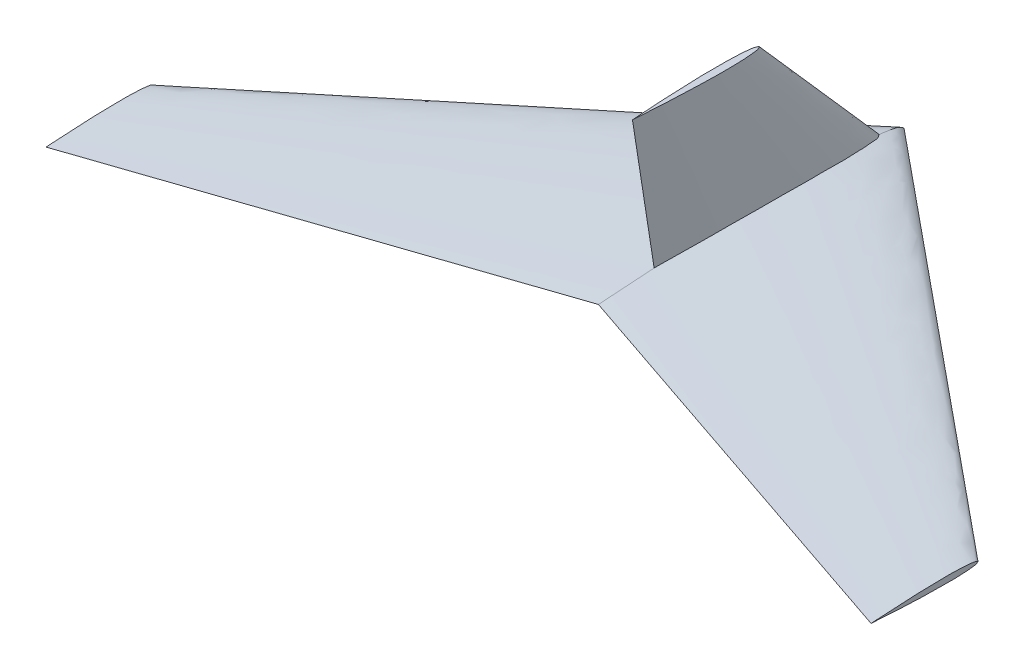
ISO-10303-21;
HEADER;
FILE_DESCRIPTION(('STEP AP214'),'2;1');
FILE_NAME('part.step','',(''),(''),'','','');
FILE_SCHEMA(('AUTOMOTIVE_DESIGN { 1 0 10303 214 1 1 1 1 }'));
ENDSEC;
DATA;
#1=APPLICATION_CONTEXT('core data for automotive mechanical design processes');
#2=APPLICATION_PROTOCOL_DEFINITION('international standard','automotive_design',2000,#1);
#3=PRODUCT_CONTEXT('',#1,'mechanical');
#4=PRODUCT('Part','Part','',(#3));
#5=PRODUCT_RELATED_PRODUCT_CATEGORY('part','',(#4));
#6=PRODUCT_DEFINITION_FORMATION('','',#4);
#7=PRODUCT_DEFINITION_CONTEXT('part definition',#1,'design');
#8=PRODUCT_DEFINITION('design','',#6,#7);
#9=PRODUCT_DEFINITION_SHAPE('','',#8);
#10=(LENGTH_UNIT() NAMED_UNIT(*) SI_UNIT(.MILLI.,.METRE.));
#11=(NAMED_UNIT(*) PLANE_ANGLE_UNIT() SI_UNIT($,.RADIAN.));
#12=(NAMED_UNIT(*) SI_UNIT($,.STERADIAN.) SOLID_ANGLE_UNIT());
#13=UNCERTAINTY_MEASURE_WITH_UNIT(LENGTH_MEASURE(1.E-05),#10,'distance_accuracy_value','');
#14=(GEOMETRIC_REPRESENTATION_CONTEXT(3) GLOBAL_UNCERTAINTY_ASSIGNED_CONTEXT((#13)) GLOBAL_UNIT_ASSIGNED_CONTEXT((#10,
#11,#12)) REPRESENTATION_CONTEXT('',''));
#15=CARTESIAN_POINT('',(0.,0.,0.));
#16=DIRECTION('',(0.,0.,1.));
#17=DIRECTION('',(1.,0.,0.));
#18=AXIS2_PLACEMENT_3D('',#15,#16,#17);
#19=CARTESIAN_POINT('',(169.048638093721,0.,3678.80680369788));
#20=DIRECTION('',(0.,1.,0.));
#21=DIRECTION('',(0.,0.,1.));
#22=AXIS2_PLACEMENT_3D('',#19,#20,#21);
#23=PLANE('',#22);
#24=CARTESIAN_POINT('',(0.,0.,516.886003926639));
#25=CARTESIAN_POINT('',(45.8207894031512,0.,566.726129294216));
#26=CARTESIAN_POINT('',(90.0378203332907,0.,665.52480429355));
#27=CARTESIAN_POINT('',(109.467536256238,0.,784.899574098195));
#28=CARTESIAN_POINT('',(125.533371463105,0.,892.997070255841));
#29=CARTESIAN_POINT('',(134.196663748753,0.,959.911072593668));
#30=CARTESIAN_POINT('',(143.81003462035,0.,1056.54344499108));
#31=CARTESIAN_POINT('',(147.424120590447,0.,1103.20925474082));
#32=CARTESIAN_POINT('',(159.116619601026,0.,1258.95858259551));
#33=CARTESIAN_POINT('',(167.510054020906,0.,1381.43738781366));
#34=CARTESIAN_POINT('',(178.127910874448,0.,1592.320012546));
#35=CARTESIAN_POINT('',(181.711257453375,0.,1691.43359717004));
#36=CARTESIAN_POINT('',(190.125834264574,0.,1993.84919897284));
#37=CARTESIAN_POINT('',(191.949271073119,0.,2207.48699344226));
#38=CARTESIAN_POINT('',(190.969228292317,0.,2842.77528736271));
#39=CARTESIAN_POINT('',(177.198699311923,0.,3478.64563622475));
#40=CARTESIAN_POINT('',(124.519555408751,0.,4960.27037671876));
#41=CARTESIAN_POINT('',(62.9565912711752,0.,6018.11151107219));
#42=CARTESIAN_POINT('',(0.,0.,6863.57614790178));
#43=B_SPLINE_CURVE_WITH_KNOTS('',3,(#24,#25,#26,#27,#28,#29,#30,#31,#32,#33,#34,#35,#36,#37,#38,
#39,#40,#41,#42),.UNSPECIFIED.,.F.,.F.,(4,1,1,1,1,1,1,1,1,1,1,1,1,1,1,1,4),(0.,
0.029705780567431,0.0510978464013305,0.0565096357559559,0.0809910879672366,0.082880755058226,
0.102210307338613,0.102991410163562,0.156309200171479,0.159955171185029,0.20230384136123,
0.202945691678,0.3022274459203,0.302769462093602,0.501714656703684,0.601305070177069,1.),.UNSPECIFIED.);
#44=CARTESIAN_POINT('',(0.,0.,6863.57614790178));
#45=VERTEX_POINT('',#44);
#46=CARTESIAN_POINT('',(0.,0.,516.886003926639));
#47=VERTEX_POINT('',#46);
#48=EDGE_CURVE('E91',#45,#47,#43,.F.);
#49=ORIENTED_EDGE('',*,*,#48,.F.);
#50=CARTESIAN_POINT('',(0.,0.,6863.57614790178));
#51=CARTESIAN_POINT('',(-62.9565912711742,0.,6018.11151107219));
#52=CARTESIAN_POINT('',(-124.51955540875,0.,4960.27037671876));
#53=CARTESIAN_POINT('',(-177.198699311923,0.,3478.64563622475));
#54=CARTESIAN_POINT('',(-190.969228292316,0.,2842.77528736271));
#55=CARTESIAN_POINT('',(-191.949271073119,0.,2207.48699344226));
#56=CARTESIAN_POINT('',(-190.125834264574,0.,1993.84919897284));
#57=CARTESIAN_POINT('',(-181.711257453375,0.,1691.43359717004));
#58=CARTESIAN_POINT('',(-178.127910874448,0.,1592.320012546));
#59=CARTESIAN_POINT('',(-167.510054020906,0.,1381.43738781366));
#60=CARTESIAN_POINT('',(-159.116619601026,0.,1258.95858259551));
#61=CARTESIAN_POINT('',(-147.424120590447,0.,1103.20925474082));
#62=CARTESIAN_POINT('',(-143.81003462035,0.,1056.54344499108));
#63=CARTESIAN_POINT('',(-134.196663748753,0.,959.911072593668));
#64=CARTESIAN_POINT('',(-125.533371463105,0.,892.997070255842));
#65=CARTESIAN_POINT('',(-109.467536256238,0.,784.899574098195));
#66=CARTESIAN_POINT('',(-90.0378203332908,0.,665.52480429355));
#67=CARTESIAN_POINT('',(-45.8207894031512,0.,566.726129294215));
#68=CARTESIAN_POINT('',(0.,0.,516.886003926639));
#69=B_SPLINE_CURVE_WITH_KNOTS('',3,(#50,#51,#52,#53,#54,#55,#56,#57,#58,#59,#60,#61,#62,#63,#64,
#65,#66,#67,#68),.UNSPECIFIED.,.F.,.F.,(4,1,1,1,1,1,1,1,1,1,1,1,1,1,1,1,4),(0.,
0.398694929822931,0.498285343296316,0.697230537906398,0.6977725540797,0.797054308322,
0.79769615863877,0.840044828814971,0.843690799828521,0.897008589836438,0.897789692661387,
0.917119244941774,0.919008912032763,0.943490364244044,0.948902153598669,0.970294219432569,1.),.UNSPECIFIED.);
#70=EDGE_CURVE('E55',#47,#45,#69,.F.);
#71=ORIENTED_EDGE('',*,*,#70,.F.);
#72=EDGE_LOOP('',(#49,#71));
#73=FACE_BOUND('',#72,.T.);
#74=ADVANCED_FACE('F52',(#73),#23,.F.);
#75=CARTESIAN_POINT('',(-91.4293187967412,3934.94788926458,5725.55395102948));
#76=DIRECTION('',(0.,1.,0.));
#77=DIRECTION('',(-1.,0.,0.));
#78=AXIS2_PLACEMENT_3D('',#75,#76,#77);
#79=PLANE('',#78);
#80=CARTESIAN_POINT('',(5.34655474382157E-13,3934.94788926458,7476.84839883558));
#81=CARTESIAN_POINT('',(-38.6995431845257,3934.94788926458,7012.10167583113));
#82=CARTESIAN_POINT('',(-63.0929552770818,3934.94788926458,6430.21164353365));
#83=CARTESIAN_POINT('',(-96.5961599785163,3934.94788926458,5615.47919103513));
#84=CARTESIAN_POINT('',(-105.495024727384,3934.94788926458,5265.88713675525));
#85=CARTESIAN_POINT('',(-103.650189086708,3934.94788926458,4916.60925293619));
#86=CARTESIAN_POINT('',(-101.23258214685,3934.94788926458,4799.15163096911));
#87=CARTESIAN_POINT('',(-97.6033674317839,3934.94788926458,4632.86747306391));
#88=CARTESIAN_POINT('',(-96.3668863805502,3934.94788926458,4578.36713715563));
#89=CARTESIAN_POINT('',(-90.9450805804445,3934.94788926458,4462.32505269457));
#90=CARTESIAN_POINT('',(-85.892388582414,3934.94788926458,4394.88336964548));
#91=CARTESIAN_POINT('',(-79.0797968788908,3934.94788926458,4309.4927405609));
#92=CARTESIAN_POINT('',(-76.9721287991294,3934.94788926458,4283.94065245036));
#93=CARTESIAN_POINT('',(-71.1822453400648,3934.94788926458,4230.45938352845));
#94=CARTESIAN_POINT('',(-66.0833867967013,3934.94788926458,4193.05251983634));
#95=CARTESIAN_POINT('',(-59.3992631429523,3934.94788926458,4135.50458384169));
#96=CARTESIAN_POINT('',(-50.1765938107412,3934.94788926458,4072.55621964549));
#97=CARTESIAN_POINT('',(-15.5863474480297,3934.94788926458,4000.64708880467));
#98=CARTESIAN_POINT('',(0.,3934.94788926458,3986.16881964926));
#99=B_SPLINE_CURVE_WITH_KNOTS('',3,(#80,#81,#82,#83,#84,#85,#86,#87,#88,#89,#90,#91,#92,#93,#94,
#95,#96,#97,#98),.UNSPECIFIED.,.F.,.F.,(4,1,1,1,1,1,1,1,1,1,1,1,1,1,1,1,4),(0.,
0.398694929822931,0.498285343296316,0.697230537906398,0.6977725540797,0.797054308322,
0.79769615863877,0.840044828814971,0.843690799828521,0.897008589836438,0.897789692661387,
0.917119244941774,0.919008912032763,0.943490364244044,0.948902153598669,0.970294219432569,1.),.UNSPECIFIED.);
#100=CARTESIAN_POINT('',(5.15200991360204E-13,3934.94788926458,7476.84839883558));
#101=VERTEX_POINT('',#100);
#102=CARTESIAN_POINT('',(0.,3934.94788926458,3986.16881964926));
#103=VERTEX_POINT('',#102);
#104=EDGE_CURVE('E12',#101,#103,#99,.T.);
#105=ORIENTED_EDGE('',*,*,#104,.F.);
#106=CARTESIAN_POINT('',(0.,3934.94788926458,3986.16881964926));
#107=CARTESIAN_POINT('',(15.5863474480297,3934.94788926458,4000.64708880467));
#108=CARTESIAN_POINT('',(50.1765938107415,3934.94788926458,4072.55621964549));
#109=CARTESIAN_POINT('',(59.3992631429526,3934.94788926458,4135.50458384169));
#110=CARTESIAN_POINT('',(66.0833867967015,3934.94788926458,4193.05251983634));
#111=CARTESIAN_POINT('',(71.1822453400651,3934.94788926458,4230.45938352845));
#112=CARTESIAN_POINT('',(76.9721287991296,3934.94788926458,4283.94065245036));
#113=CARTESIAN_POINT('',(79.079796878891,3934.94788926458,4309.4927405609));
#114=CARTESIAN_POINT('',(85.8923885824143,3934.94788926458,4394.88336964547));
#115=CARTESIAN_POINT('',(90.9450805804448,3934.94788926458,4462.32505269457));
#116=CARTESIAN_POINT('',(96.3668863805506,3934.94788926458,4578.36713715563));
#117=CARTESIAN_POINT('',(97.6033674317843,3934.94788926458,4632.86747306391));
#118=CARTESIAN_POINT('',(101.23258214685,3934.94788926458,4799.15163096911));
#119=CARTESIAN_POINT('',(103.650189086708,3934.94788926458,4916.60925293619));
#120=CARTESIAN_POINT('',(105.495024727385,3934.94788926458,5265.88713675525));
#121=CARTESIAN_POINT('',(96.5961599785168,3934.94788926458,5615.47919103513));
#122=CARTESIAN_POINT('',(63.0929552770826,3934.94788926458,6430.21164353365));
#123=CARTESIAN_POINT('',(38.6995431845266,3934.94788926458,7012.10167583113));
#124=CARTESIAN_POINT('',(5.15200991360204E-13,3934.94788926458,7476.84839883558));
#125=B_SPLINE_CURVE_WITH_KNOTS('',3,(#106,#107,#108,#109,#110,#111,#112,#113,#114,#115,#116,
#117,#118,#119,#120,#121,#122,#123,#124),.UNSPECIFIED.,.F.,.F.,(4,1,1,1,1,1,1,1,1,1,1,1,1,1,1,1,
4),(0.,0.029705780567431,0.0510978464013305,0.0565096357559559,0.0809910879672366,
0.082880755058226,0.102210307338613,0.102991410163562,0.156309200171479,0.159955171185029,
0.20230384136123,0.202945691678,0.3022274459203,0.302769462093602,0.501714656703684,
0.601305070177069,1.),.UNSPECIFIED.);
#126=EDGE_CURVE('E77',#103,#101,#125,.T.);
#127=ORIENTED_EDGE('',*,*,#126,.F.);
#128=EDGE_LOOP('',(#105,#127));
#129=FACE_BOUND('',#128,.T.);
#130=ADVANCED_FACE('F78',(#129),#79,.T.);
#131=CARTESIAN_POINT('',(5.34655474382157E-13,3934.94788926458,7476.84839883558));
#132=CARTESIAN_POINT('',(0.,0.,6863.57614790178));
#133=CARTESIAN_POINT('',(-38.6995431845257,3934.94788926458,7012.10167583113));
#134=CARTESIAN_POINT('',(-62.9565912711742,0.,6018.11151107219));
#135=CARTESIAN_POINT('',(-63.0929552770818,3934.94788926458,6430.21164353365));
#136=CARTESIAN_POINT('',(-124.51955540875,0.,4960.27037671876));
#137=CARTESIAN_POINT('',(-96.5961599785163,3934.94788926458,5615.47919103513));
#138=CARTESIAN_POINT('',(-177.198699311923,0.,3478.64563622475));
#139=CARTESIAN_POINT('',(-105.495024727384,3934.94788926458,5265.88713675525));
#140=CARTESIAN_POINT('',(-190.969228292316,0.,2842.77528736271));
#141=CARTESIAN_POINT('',(-103.650189086708,3934.94788926458,4916.60925293619));
#142=CARTESIAN_POINT('',(-191.949271073119,0.,2207.48699344226));
#143=CARTESIAN_POINT('',(-101.23258214685,3934.94788926458,4799.15163096911));
#144=CARTESIAN_POINT('',(-190.125834264574,0.,1993.84919897284));
#145=CARTESIAN_POINT('',(-97.6033674317839,3934.94788926458,4632.86747306391));
#146=CARTESIAN_POINT('',(-181.711257453375,0.,1691.43359717004));
#147=CARTESIAN_POINT('',(-96.3668863805502,3934.94788926458,4578.36713715563));
#148=CARTESIAN_POINT('',(-178.127910874448,0.,1592.320012546));
#149=CARTESIAN_POINT('',(-90.9450805804445,3934.94788926458,4462.32505269457));
#150=CARTESIAN_POINT('',(-167.510054020906,0.,1381.43738781366));
#151=CARTESIAN_POINT('',(-85.892388582414,3934.94788926458,4394.88336964548));
#152=CARTESIAN_POINT('',(-159.116619601026,0.,1258.95858259551));
#153=CARTESIAN_POINT('',(-79.0797968788908,3934.94788926458,4309.4927405609));
#154=CARTESIAN_POINT('',(-147.424120590447,0.,1103.20925474082));
#155=CARTESIAN_POINT('',(-76.9721287991294,3934.94788926458,4283.94065245036));
#156=CARTESIAN_POINT('',(-143.81003462035,0.,1056.54344499108));
#157=CARTESIAN_POINT('',(-71.1822453400648,3934.94788926458,4230.45938352845));
#158=CARTESIAN_POINT('',(-134.196663748753,0.,959.911072593668));
#159=CARTESIAN_POINT('',(-66.0833867967013,3934.94788926458,4193.05251983634));
#160=CARTESIAN_POINT('',(-125.533371463105,0.,892.997070255842));
#161=CARTESIAN_POINT('',(-59.3992631429523,3934.94788926458,4135.50458384169));
#162=CARTESIAN_POINT('',(-109.467536256238,0.,784.899574098195));
#163=CARTESIAN_POINT('',(-50.1765938107412,3934.94788926458,4072.55621964549));
#164=CARTESIAN_POINT('',(-90.0378203332908,0.,665.52480429355));
#165=CARTESIAN_POINT('',(-15.5863474480297,3934.94788926458,4000.64708880467));
#166=CARTESIAN_POINT('',(-45.8207894031512,0.,566.726129294215));
#167=CARTESIAN_POINT('',(0.,3934.94788926458,3986.16881964926));
#168=CARTESIAN_POINT('',(0.,0.,516.886003926639));
#169=B_SPLINE_SURFACE_WITH_KNOTS('',3,1,((#131,#132),(#133,#134),(#135,#136),(#137,#138),(#139,
#140),(#141,#142),(#143,#144),(#145,#146),(#147,#148),(#149,#150),(#151,#152),(#153,#154),(#155,
#156),(#157,#158),(#159,#160),(#161,#162),(#163,#164),(#165,#166),(#167,#168)),.UNSPECIFIED.,
.F.,.F.,.F.,(4,1,1,1,1,1,1,1,1,1,1,1,1,1,1,1,4),(2,2),(0.,0.398694929822931,0.498285343296316,
0.697230537906398,0.6977725540797,0.797054308322,0.79769615863877,0.840044828814971,
0.843690799828521,0.897008589836438,0.897789692661387,0.917119244941774,0.919008912032763,
0.943490364244044,0.948902153598669,0.970294219432569,1.),(0.,1.),.UNSPECIFIED.);
#170=DIRECTION('',(0.,0.750095977904658,0.661328983132642));
#171=VECTOR('',#170,1.);
#172=CARTESIAN_POINT('',(0.,1967.47394463229,2251.52741178795));
#173=LINE('',#172,#171);
#174=EDGE_CURVE('E89',#47,#103,#173,.T.);
#175=DIRECTION('',(0.,-0.988071835346758,-0.153993662838736));
#176=VECTOR('',#175,1.);
#177=CARTESIAN_POINT('',(2.48694154469873E-13,1967.47394463229,7170.21227336868));
#178=LINE('',#177,#176);
#179=EDGE_CURVE('E84',#101,#45,#178,.T.);
#180=ORIENTED_EDGE('',*,*,#104,.T.);
#181=ORIENTED_EDGE('',*,*,#174,.F.);
#182=ORIENTED_EDGE('',*,*,#70,.T.);
#183=ORIENTED_EDGE('',*,*,#179,.F.);
#184=EDGE_LOOP('',(#180,#181,#182,#183));
#185=FACE_BOUND('',#184,.T.);
#186=ADVANCED_FACE('F88',(#185),#169,.T.);
#187=CARTESIAN_POINT('',(0.,3934.94788926458,3986.16881964926));
#188=CARTESIAN_POINT('',(0.,0.,516.886003926639));
#189=CARTESIAN_POINT('',(15.5863474480297,3934.94788926458,4000.64708880467));
#190=CARTESIAN_POINT('',(45.8207894031512,0.,566.726129294216));
#191=CARTESIAN_POINT('',(50.1765938107415,3934.94788926458,4072.55621964549));
#192=CARTESIAN_POINT('',(90.0378203332907,0.,665.52480429355));
#193=CARTESIAN_POINT('',(59.3992631429526,3934.94788926458,4135.50458384169));
#194=CARTESIAN_POINT('',(109.467536256238,0.,784.899574098195));
#195=CARTESIAN_POINT('',(66.0833867967015,3934.94788926458,4193.05251983634));
#196=CARTESIAN_POINT('',(125.533371463105,0.,892.997070255841));
#197=CARTESIAN_POINT('',(71.1822453400651,3934.94788926458,4230.45938352845));
#198=CARTESIAN_POINT('',(134.196663748753,0.,959.911072593668));
#199=CARTESIAN_POINT('',(76.9721287991296,3934.94788926458,4283.94065245036));
#200=CARTESIAN_POINT('',(143.81003462035,0.,1056.54344499108));
#201=CARTESIAN_POINT('',(79.079796878891,3934.94788926458,4309.4927405609));
#202=CARTESIAN_POINT('',(147.424120590447,0.,1103.20925474082));
#203=CARTESIAN_POINT('',(85.8923885824143,3934.94788926458,4394.88336964547));
#204=CARTESIAN_POINT('',(159.116619601026,0.,1258.95858259551));
#205=CARTESIAN_POINT('',(90.9450805804448,3934.94788926458,4462.32505269457));
#206=CARTESIAN_POINT('',(167.510054020906,0.,1381.43738781366));
#207=CARTESIAN_POINT('',(96.3668863805506,3934.94788926458,4578.36713715563));
#208=CARTESIAN_POINT('',(178.127910874448,0.,1592.320012546));
#209=CARTESIAN_POINT('',(97.6033674317843,3934.94788926458,4632.86747306391));
#210=CARTESIAN_POINT('',(181.711257453375,0.,1691.43359717004));
#211=CARTESIAN_POINT('',(101.23258214685,3934.94788926458,4799.15163096911));
#212=CARTESIAN_POINT('',(190.125834264574,0.,1993.84919897284));
#213=CARTESIAN_POINT('',(103.650189086708,3934.94788926458,4916.60925293619));
#214=CARTESIAN_POINT('',(191.949271073119,0.,2207.48699344226));
#215=CARTESIAN_POINT('',(105.495024727385,3934.94788926458,5265.88713675525));
#216=CARTESIAN_POINT('',(190.969228292317,0.,2842.77528736271));
#217=CARTESIAN_POINT('',(96.5961599785168,3934.94788926458,5615.47919103513));
#218=CARTESIAN_POINT('',(177.198699311923,0.,3478.64563622475));
#219=CARTESIAN_POINT('',(63.0929552770826,3934.94788926458,6430.21164353365));
#220=CARTESIAN_POINT('',(124.519555408751,0.,4960.27037671876));
#221=CARTESIAN_POINT('',(38.6995431845266,3934.94788926458,7012.10167583113));
#222=CARTESIAN_POINT('',(62.9565912711752,0.,6018.11151107219));
#223=CARTESIAN_POINT('',(5.15200991360204E-13,3934.94788926458,7476.84839883558));
#224=CARTESIAN_POINT('',(0.,0.,6863.57614790178));
#225=B_SPLINE_SURFACE_WITH_KNOTS('',3,1,((#187,#188),(#189,#190),(#191,#192),(#193,#194),(#195,
#196),(#197,#198),(#199,#200),(#201,#202),(#203,#204),(#205,#206),(#207,#208),(#209,#210),(#211,
#212),(#213,#214),(#215,#216),(#217,#218),(#219,#220),(#221,#222),(#223,#224)),.UNSPECIFIED.,
.F.,.F.,.F.,(4,1,1,1,1,1,1,1,1,1,1,1,1,1,1,1,4),(2,2),(0.,0.029705780567431,0.0510978464013305,
0.0565096357559559,0.0809910879672366,0.082880755058226,0.102210307338613,0.102991410163562,
0.156309200171479,0.159955171185029,0.20230384136123,0.202945691678,0.3022274459203,
0.302769462093602,0.501714656703684,0.601305070177069,1.),(0.,1.),.UNSPECIFIED.);
#226=ORIENTED_EDGE('',*,*,#126,.T.);
#227=ORIENTED_EDGE('',*,*,#179,.T.);
#228=ORIENTED_EDGE('',*,*,#48,.T.);
#229=ORIENTED_EDGE('',*,*,#174,.T.);
#230=EDGE_LOOP('',(#226,#227,#228,#229));
#231=FACE_BOUND('',#230,.T.);
#232=ADVANCED_FACE('F90',(#231),#225,.T.);
#233=CLOSED_SHELL('',(#74,#130,#186,#232));
#234=MANIFOLD_SOLID_BREP('B2',#233);
#235=CARTESIAN_POINT('',(11359.2161155703,76.8514653206255,10788.4222084638));
#236=DIRECTION('',(-1.,0.,0.));
#237=DIRECTION('',(0.,0.,-1.));
#238=AXIS2_PLACEMENT_3D('',#235,#236,#237);
#239=PLANE('',#238);
#240=CARTESIAN_POINT('',(11359.2161155703,-1.34095460673236E-12,12266.1037591124));
#241=CARTESIAN_POINT('',(11359.2161155703,18.8203520967069,11971.8910815032));
#242=CARTESIAN_POINT('',(11359.2161155703,49.9882583828807,11481.3378290713));
#243=CARTESIAN_POINT('',(11359.2161155703,70.9835794585614,10990.1821505142));
#244=CARTESIAN_POINT('',(11359.2161155703,82.3956799870032,10597.8339155743));
#245=CARTESIAN_POINT('',(11359.2161155703,85.4412528497841,10401.1726121632));
#246=CARTESIAN_POINT('',(11359.2161155703,86.9538383032913,10106.6703660128));
#247=CARTESIAN_POINT('',(11359.2161155703,86.9309217643893,10007.9894461031));
#248=CARTESIAN_POINT('',(11359.2161155703,82.4823559531746,9863.96128521647));
#249=CARTESIAN_POINT('',(11359.2161155703,80.1454595299337,9812.41655254454));
#250=CARTESIAN_POINT('',(11359.2161155703,74.7337293030059,9714.01184201355));
#251=CARTESIAN_POINT('',(11359.2161155703,71.3004715154824,9661.46365869842));
#252=CARTESIAN_POINT('',(11359.2161155703,65.8455880886711,9591.98239167028));
#253=CARTESIAN_POINT('',(11359.2161155703,63.8302413863627,9568.27058077111));
#254=CARTESIAN_POINT('',(11359.2161155703,58.7328780892101,9522.39970973608));
#255=CARTESIAN_POINT('',(11359.2161155703,55.1925855489482,9496.91518607539));
#256=CARTESIAN_POINT('',(11359.2161155703,45.0254946563833,9419.06959226612));
#257=CARTESIAN_POINT('',(11359.2161155703,39.0349502011655,9362.32915647395));
#258=CARTESIAN_POINT('',(11359.2161155703,0.,9321.12180322383));
#259=B_SPLINE_CURVE_WITH_KNOTS('',3,(#240,#241,#242,#243,#244,#245,#246,#247,#248,#249,#250,
#251,#252,#253,#254,#255,#256,#257,#258),.UNSPECIFIED.,.F.,.F.,(4,1,1,1,1,1,1,1,1,1,1,1,1,1,1,1,
4),(0.,0.298931815970666,0.498152968932553,0.498299211220126,0.696834066796415,
0.697522121171649,0.796796462208503,0.796844070583475,0.843589068570306,0.849087559843308,
0.896763932817385,0.896989321780881,0.919683005075993,0.920855221312246,0.943853286653914,
0.945874325951042,1.),.UNSPECIFIED.);
#260=CARTESIAN_POINT('',(11359.2161155703,0.,9321.12180322383));
#261=VERTEX_POINT('',#260);
#262=CARTESIAN_POINT('',(11359.2161155703,-1.33877835778621E-12,12266.1037591124));
#263=VERTEX_POINT('',#262);
#264=EDGE_CURVE('E228',#261,#263,#259,.F.);
#265=ORIENTED_EDGE('',*,*,#264,.T.);
#266=CARTESIAN_POINT('',(11359.2161155703,0.,9321.12180322383));
#267=CARTESIAN_POINT('',(11359.2161155703,-39.0349502011679,9362.32915647395));
#268=CARTESIAN_POINT('',(11359.2161155703,-45.0254946563853,9419.06959226613));
#269=CARTESIAN_POINT('',(11359.2161155703,-55.1925855489501,9496.91518607539));
#270=CARTESIAN_POINT('',(11359.2161155703,-58.7328780892121,9522.39970973607));
#271=CARTESIAN_POINT('',(11359.2161155703,-63.8302413863647,9568.2705807711));
#272=CARTESIAN_POINT('',(11359.2161155703,-65.8455880886731,9591.98239167028));
#273=CARTESIAN_POINT('',(11359.2161155703,-71.3004715154844,9661.46365869842));
#274=CARTESIAN_POINT('',(11359.2161155703,-74.7337293030079,9714.01184201355));
#275=CARTESIAN_POINT('',(11359.2161155703,-80.1454595299357,9812.41655254454));
#276=CARTESIAN_POINT('',(11359.2161155703,-82.4823559531767,9863.96128521647));
#277=CARTESIAN_POINT('',(11359.2161155703,-86.9309217643914,10007.9894461031));
#278=CARTESIAN_POINT('',(11359.2161155703,-86.9538383032934,10106.6703660128));
#279=CARTESIAN_POINT('',(11359.2161155703,-85.4412528497863,10401.1726121632));
#280=CARTESIAN_POINT('',(11359.2161155703,-82.3956799870054,10597.8339155743));
#281=CARTESIAN_POINT('',(11359.2161155703,-70.9835794585637,10990.1821505142));
#282=CARTESIAN_POINT('',(11359.2161155703,-49.9882583828832,11481.3378290713));
#283=CARTESIAN_POINT('',(11359.2161155703,-18.8203520967096,11971.8910815032));
#284=CARTESIAN_POINT('',(11359.2161155703,-1.33877835778621E-12,12266.1037591124));
#285=B_SPLINE_CURVE_WITH_KNOTS('',3,(#266,#267,#268,#269,#270,#271,#272,#273,#274,#275,#276,
#277,#278,#279,#280,#281,#282,#283,#284),.UNSPECIFIED.,.F.,.F.,(4,1,1,1,1,1,1,1,1,1,1,1,1,1,1,1,
4),(0.,0.0541256740489585,0.0561467133460857,0.0791447786877544,0.0803169949240068,
0.103010678219119,0.103236067182615,0.150912440156692,0.156410931429694,0.203155929416525,
0.203203537791498,0.302477878828351,0.303165933203585,0.501700788779874,0.501847031067447,
0.701068184029334,1.),.UNSPECIFIED.);
#286=EDGE_CURVE('E259',#263,#261,#285,.F.);
#287=ORIENTED_EDGE('',*,*,#286,.T.);
#288=EDGE_LOOP('',(#265,#287));
#289=FACE_BOUND('',#288,.T.);
#290=ADVANCED_FACE('F225',(#289),#239,.F.);
#291=CARTESIAN_POINT('',(-11359.2161155703,76.8514653206255,10788.4222084638));
#292=DIRECTION('',(1.,0.,0.));
#293=DIRECTION('',(0.,0.,-1.));
#294=AXIS2_PLACEMENT_3D('',#291,#292,#293);
#295=PLANE('',#294);
#296=CARTESIAN_POINT('',(-11359.2161155703,-1.34095460673236E-12,12266.1037591124));
#297=CARTESIAN_POINT('',(-11359.2161155703,18.8203520967069,11971.8910815032));
#298=CARTESIAN_POINT('',(-11359.2161155703,49.9882583828807,11481.3378290713));
#299=CARTESIAN_POINT('',(-11359.2161155703,70.9835794585614,10990.1821505142));
#300=CARTESIAN_POINT('',(-11359.2161155703,82.3956799870032,10597.8339155743));
#301=CARTESIAN_POINT('',(-11359.2161155703,85.4412528497841,10401.1726121632));
#302=CARTESIAN_POINT('',(-11359.2161155703,86.9538383032913,10106.6703660128));
#303=CARTESIAN_POINT('',(-11359.2161155703,86.9309217643893,10007.9894461031));
#304=CARTESIAN_POINT('',(-11359.2161155703,82.4823559531746,9863.96128521647));
#305=CARTESIAN_POINT('',(-11359.2161155703,80.1454595299337,9812.41655254454));
#306=CARTESIAN_POINT('',(-11359.2161155703,74.7337293030059,9714.01184201355));
#307=CARTESIAN_POINT('',(-11359.2161155703,71.3004715154824,9661.46365869842));
#308=CARTESIAN_POINT('',(-11359.2161155703,65.8455880886711,9591.98239167028));
#309=CARTESIAN_POINT('',(-11359.2161155703,63.8302413863627,9568.27058077111));
#310=CARTESIAN_POINT('',(-11359.2161155703,58.7328780892101,9522.39970973608));
#311=CARTESIAN_POINT('',(-11359.2161155703,55.1925855489482,9496.91518607539));
#312=CARTESIAN_POINT('',(-11359.2161155703,45.0254946563833,9419.06959226612));
#313=CARTESIAN_POINT('',(-11359.2161155703,39.0349502011655,9362.32915647395));
#314=CARTESIAN_POINT('',(-11359.2161155703,0.,9321.12180322383));
#315=B_SPLINE_CURVE_WITH_KNOTS('',3,(#296,#297,#298,#299,#300,#301,#302,#303,#304,#305,#306,
#307,#308,#309,#310,#311,#312,#313,#314),.UNSPECIFIED.,.F.,.F.,(4,1,1,1,1,1,1,1,1,1,1,1,1,1,1,1,
4),(0.,0.298931815970666,0.498152968932553,0.498299211220126,0.696834066796415,
0.697522121171649,0.796796462208503,0.796844070583475,0.843589068570306,0.849087559843308,
0.896763932817385,0.896989321780881,0.919683005075993,0.920855221312246,0.943853286653914,
0.945874325951042,1.),.UNSPECIFIED.);
#316=CARTESIAN_POINT('',(-11359.2161155703,0.,9321.12180322383));
#317=VERTEX_POINT('',#316);
#318=CARTESIAN_POINT('',(-11359.2161155703,-1.33877835778621E-12,12266.1037591124));
#319=VERTEX_POINT('',#318);
#320=EDGE_CURVE('E237',#317,#319,#315,.F.);
#321=ORIENTED_EDGE('',*,*,#320,.F.);
#322=CARTESIAN_POINT('',(-11359.2161155703,0.,9321.12180322383));
#323=CARTESIAN_POINT('',(-11359.2161155703,-39.0349502011679,9362.32915647395));
#324=CARTESIAN_POINT('',(-11359.2161155703,-45.0254946563853,9419.06959226613));
#325=CARTESIAN_POINT('',(-11359.2161155703,-55.1925855489501,9496.91518607539));
#326=CARTESIAN_POINT('',(-11359.2161155703,-58.7328780892121,9522.39970973607));
#327=CARTESIAN_POINT('',(-11359.2161155703,-63.8302413863647,9568.2705807711));
#328=CARTESIAN_POINT('',(-11359.2161155703,-65.8455880886731,9591.98239167028));
#329=CARTESIAN_POINT('',(-11359.2161155703,-71.3004715154844,9661.46365869842));
#330=CARTESIAN_POINT('',(-11359.2161155703,-74.7337293030079,9714.01184201355));
#331=CARTESIAN_POINT('',(-11359.2161155703,-80.1454595299357,9812.41655254454));
#332=CARTESIAN_POINT('',(-11359.2161155703,-82.4823559531767,9863.96128521647));
#333=CARTESIAN_POINT('',(-11359.2161155703,-86.9309217643914,10007.9894461031));
#334=CARTESIAN_POINT('',(-11359.2161155703,-86.9538383032934,10106.6703660128));
#335=CARTESIAN_POINT('',(-11359.2161155703,-85.4412528497863,10401.1726121632));
#336=CARTESIAN_POINT('',(-11359.2161155703,-82.3956799870054,10597.8339155743));
#337=CARTESIAN_POINT('',(-11359.2161155703,-70.9835794585637,10990.1821505142));
#338=CARTESIAN_POINT('',(-11359.2161155703,-49.9882583828832,11481.3378290713));
#339=CARTESIAN_POINT('',(-11359.2161155703,-18.8203520967096,11971.8910815032));
#340=CARTESIAN_POINT('',(-11359.2161155703,-1.33877835778621E-12,12266.1037591124));
#341=B_SPLINE_CURVE_WITH_KNOTS('',3,(#322,#323,#324,#325,#326,#327,#328,#329,#330,#331,#332,
#333,#334,#335,#336,#337,#338,#339,#340),.UNSPECIFIED.,.F.,.F.,(4,1,1,1,1,1,1,1,1,1,1,1,1,1,1,1,
4),(0.,0.0541256740489585,0.0561467133460857,0.0791447786877544,0.0803169949240068,
0.103010678219119,0.103236067182615,0.150912440156692,0.156410931429694,0.203155929416525,
0.203203537791498,0.302477878828351,0.303165933203585,0.501700788779874,0.501847031067447,
0.701068184029334,1.),.UNSPECIFIED.);
#342=EDGE_CURVE('E297',#319,#317,#341,.F.);
#343=ORIENTED_EDGE('',*,*,#342,.F.);
#344=EDGE_LOOP('',(#321,#343));
#345=FACE_BOUND('',#344,.T.);
#346=ADVANCED_FACE('F351',(#345),#295,.F.);
#347=CARTESIAN_POINT('',(0.,-1.03584151514388E-12,8414.2341596817));
#348=CARTESIAN_POINT('',(11359.2161155703,-1.34095460673236E-12,12266.1037591124));
#349=CARTESIAN_POINT('',(0.,64.7920514607161,7574.06443176734));
#350=CARTESIAN_POINT('',(11359.2161155703,18.8203520967069,11971.8910815032));
#351=CARTESIAN_POINT('',(0.,148.494411022616,6172.1296219586));
#352=CARTESIAN_POINT('',(11359.2161155703,49.9882583828807,11481.3378290713));
#353=CARTESIAN_POINT('',(0.,208.057487147225,4768.80033309058));
#354=CARTESIAN_POINT('',(11359.2161155703,70.9835794585614,10990.1821505142));
#355=CARTESIAN_POINT('',(0.,244.442770083536,3647.59962187171));
#356=CARTESIAN_POINT('',(11359.2161155703,82.3956799870032,10597.8339155743));
#357=CARTESIAN_POINT('',(0.,257.091372536718,3085.51507252471));
#358=CARTESIAN_POINT('',(11359.2161155703,85.4412528497841,10401.1726121632));
#359=CARTESIAN_POINT('',(0.,253.102036890415,2244.22059630675));
#360=CARTESIAN_POINT('',(11359.2161155703,86.9538383032913,10106.6703660128));
#361=CARTESIAN_POINT('',(0.,247.902646496169,1962.39382293248));
#362=CARTESIAN_POINT('',(11359.2161155703,86.9309217643893,10007.9894461031));
#363=CARTESIAN_POINT('',(0.,240.689336539155,1550.55652902122));
#364=CARTESIAN_POINT('',(11359.2161155703,82.4823559531746,9863.96128521647));
#365=CARTESIAN_POINT('',(0.,238.171676754806,1403.08364495362));
#366=CARTESIAN_POINT('',(11359.2161155703,80.1454595299337,9812.41655254454));
#367=CARTESIAN_POINT('',(0.,222.91221545098,1121.94901643392));
#368=CARTESIAN_POINT('',(11359.2161155703,74.7337293030059,9714.01184201355));
#369=CARTESIAN_POINT('',(0.,208.396099353381,972.109774250955));
#370=CARTESIAN_POINT('',(11359.2161155703,71.3004715154824,9661.46365869842));
#371=CARTESIAN_POINT('',(0.,194.440638219348,773.448943042979));
#372=CARTESIAN_POINT('',(11359.2161155703,65.8455880886711,9591.98239167028));
#373=CARTESIAN_POINT('',(0.,190.542859216547,705.559975496836));
#374=CARTESIAN_POINT('',(11359.2161155703,63.8302413863627,9568.27058077111));
#375=CARTESIAN_POINT('',(0.,176.271721196786,574.429923088583));
#376=CARTESIAN_POINT('',(11359.2161155703,58.7328780892101,9522.39970973608));
#377=CARTESIAN_POINT('',(0.,164.724712547587,501.620254564058));
#378=CARTESIAN_POINT('',(11359.2161155703,55.1925855489482,9496.91518607539));
#379=CARTESIAN_POINT('',(0.,131.844814983985,279.946911371155));
#380=CARTESIAN_POINT('',(11359.2161155703,45.0254946563833,9419.06959226612));
#381=CARTESIAN_POINT('',(0.,108.2931123675,121.364540484391));
#382=CARTESIAN_POINT('',(11359.2161155703,39.0349502011655,9362.32915647395));
#383=CARTESIAN_POINT('',(0.,0.,0.));
#384=CARTESIAN_POINT('',(11359.2161155703,0.,9321.12180322383));
#385=B_SPLINE_SURFACE_WITH_KNOTS('',3,1,((#347,#348),(#349,#350),(#351,#352),(#353,#354),(#355,
#356),(#357,#358),(#359,#360),(#361,#362),(#363,#364),(#365,#366),(#367,#368),(#369,#370),(#371,
#372),(#373,#374),(#375,#376),(#377,#378),(#379,#380),(#381,#382),(#383,#384)),.UNSPECIFIED.,
.F.,.F.,.F.,(4,1,1,1,1,1,1,1,1,1,1,1,1,1,1,1,4),(2,2),(0.,0.298931815970666,0.498152968932553,
0.498299211220126,0.696834066796415,0.697522121171649,0.796796462208503,0.796844070583475,
0.843589068570306,0.849087559843308,0.896763932817385,0.896989321780881,0.919683005075993,
0.920855221312246,0.943853286653914,0.945874325951042,1.),(0.,1.),.UNSPECIFIED.);
#386=CARTESIAN_POINT('',(0.,-1.03584151514388E-12,8414.2341596817));
#387=CARTESIAN_POINT('',(0.,64.7920514607161,7574.06443176734));
#388=CARTESIAN_POINT('',(0.,148.494411022616,6172.1296219586));
#389=CARTESIAN_POINT('',(0.,208.057487147225,4768.80033309058));
#390=CARTESIAN_POINT('',(0.,244.442770083536,3647.59962187171));
#391=CARTESIAN_POINT('',(0.,257.091372536718,3085.51507252471));
#392=CARTESIAN_POINT('',(0.,253.102036890415,2244.22059630675));
#393=CARTESIAN_POINT('',(0.,247.902646496169,1962.39382293248));
#394=CARTESIAN_POINT('',(0.,240.689336539155,1550.55652902122));
#395=CARTESIAN_POINT('',(0.,238.171676754806,1403.08364495362));
#396=CARTESIAN_POINT('',(0.,222.91221545098,1121.94901643392));
#397=CARTESIAN_POINT('',(0.,208.396099353381,972.109774250955));
#398=CARTESIAN_POINT('',(0.,194.440638219348,773.448943042979));
#399=CARTESIAN_POINT('',(0.,190.542859216547,705.559975496836));
#400=CARTESIAN_POINT('',(0.,176.271721196786,574.429923088583));
#401=CARTESIAN_POINT('',(0.,164.724712547587,501.620254564058));
#402=CARTESIAN_POINT('',(0.,131.844814983985,279.946911371155));
#403=CARTESIAN_POINT('',(0.,108.2931123675,121.364540484391));
#404=CARTESIAN_POINT('',(0.,0.,0.));
#405=B_SPLINE_CURVE_WITH_KNOTS('',3,(#386,#387,#388,#389,#390,#391,#392,#393,#394,#395,#396,
#397,#398,#399,#400,#401,#402,#403,#404),.UNSPECIFIED.,.F.,.F.,(4,1,1,1,1,1,1,1,1,1,1,1,1,1,1,1,
4),(0.,0.298931815970666,0.498152968932553,0.498299211220126,0.696834066796415,
0.697522121171649,0.796796462208503,0.796844070583475,0.843589068570306,0.849087559843308,
0.896763932817385,0.896989321780881,0.919683005075993,0.920855221312246,0.943853286653914,
0.945874325951042,1.),.UNSPECIFIED.);
#406=CARTESIAN_POINT('',(0.,-1.02505147104222E-12,8414.2341596817));
#407=VERTEX_POINT('',#406);
#408=CARTESIAN_POINT('',(0.,0.,0.));
#409=VERTEX_POINT('',#408);
#410=EDGE_CURVE('E188',#407,#409,#405,.T.);
#411=DIRECTION('',(0.947033228842652,0.,0.321135584244195));
#412=VECTOR('',#411,1.);
#413=CARTESIAN_POINT('',(5679.60805778514,-1.18191491441422E-12,10340.1689593971));
#414=LINE('',#413,#412);
#415=EDGE_CURVE('E264',#407,#263,#414,.T.);
#416=DIRECTION('',(-0.773048696155329,0.,-0.634346682321699));
#417=VECTOR('',#416,1.);
#418=CARTESIAN_POINT('',(5679.60805778514,0.,4660.56090161192));
#419=LINE('',#418,#417);
#420=EDGE_CURVE('E265',#261,#409,#419,.T.);
#421=ORIENTED_EDGE('',*,*,#410,.F.);
#422=ORIENTED_EDGE('',*,*,#415,.T.);
#423=ORIENTED_EDGE('',*,*,#264,.F.);
#424=ORIENTED_EDGE('',*,*,#420,.T.);
#425=EDGE_LOOP('',(#421,#422,#423,#424));
#426=FACE_BOUND('',#425,.T.);
#427=ADVANCED_FACE('F270',(#426),#385,.F.);
#428=CARTESIAN_POINT('',(0.,0.,0.));
#429=CARTESIAN_POINT('',(11359.2161155703,0.,9321.12180322383));
#430=CARTESIAN_POINT('',(0.,-108.293112367501,121.364540484392));
#431=CARTESIAN_POINT('',(11359.2161155703,-39.0349502011679,9362.32915647395));
#432=CARTESIAN_POINT('',(0.,-131.844814983985,279.946911371156));
#433=CARTESIAN_POINT('',(11359.2161155703,-45.0254946563853,9419.06959226613));
#434=CARTESIAN_POINT('',(0.,-164.724712547587,501.62025456406));
#435=CARTESIAN_POINT('',(11359.2161155703,-55.1925855489501,9496.91518607539));
#436=CARTESIAN_POINT('',(0.,-176.271721196787,574.429923088584));
#437=CARTESIAN_POINT('',(11359.2161155703,-58.7328780892121,9522.39970973607));
#438=CARTESIAN_POINT('',(0.,-190.542859216548,705.559975496837));
#439=CARTESIAN_POINT('',(11359.2161155703,-63.8302413863647,9568.2705807711));
#440=CARTESIAN_POINT('',(0.,-194.440638219348,773.44894304298));
#441=CARTESIAN_POINT('',(11359.2161155703,-65.8455880886731,9591.98239167028));
#442=CARTESIAN_POINT('',(0.,-208.396099353381,972.109774250955));
#443=CARTESIAN_POINT('',(11359.2161155703,-71.3004715154844,9661.46365869842));
#444=CARTESIAN_POINT('',(0.,-222.912215450981,1121.94901643392));
#445=CARTESIAN_POINT('',(11359.2161155703,-74.7337293030079,9714.01184201355));
#446=CARTESIAN_POINT('',(0.,-238.171676754807,1403.08364495363));
#447=CARTESIAN_POINT('',(11359.2161155703,-80.1454595299357,9812.41655254454));
#448=CARTESIAN_POINT('',(0.,-240.689336539155,1550.55652902122));
#449=CARTESIAN_POINT('',(11359.2161155703,-82.4823559531767,9863.96128521647));
#450=CARTESIAN_POINT('',(0.,-247.902646496169,1962.39382293248));
#451=CARTESIAN_POINT('',(11359.2161155703,-86.9309217643914,10007.9894461031));
#452=CARTESIAN_POINT('',(0.,-253.102036890416,2244.22059630675));
#453=CARTESIAN_POINT('',(11359.2161155703,-86.9538383032934,10106.6703660128));
#454=CARTESIAN_POINT('',(0.,-257.091372536719,3085.51507252471));
#455=CARTESIAN_POINT('',(11359.2161155703,-85.4412528497863,10401.1726121632));
#456=CARTESIAN_POINT('',(0.,-244.442770083537,3647.59962187172));
#457=CARTESIAN_POINT('',(11359.2161155703,-82.3956799870054,10597.8339155743));
#458=CARTESIAN_POINT('',(0.,-208.057487147226,4768.80033309058));
#459=CARTESIAN_POINT('',(11359.2161155703,-70.9835794585637,10990.1821505142));
#460=CARTESIAN_POINT('',(0.,-148.494411022618,6172.1296219586));
#461=CARTESIAN_POINT('',(11359.2161155703,-49.9882583828832,11481.3378290713));
#462=CARTESIAN_POINT('',(0.,-64.792051460718,7574.06443176734));
#463=CARTESIAN_POINT('',(11359.2161155703,-18.8203520967096,11971.8910815032));
#464=CARTESIAN_POINT('',(0.,-1.02505147104222E-12,8414.2341596817));
#465=CARTESIAN_POINT('',(11359.2161155703,-1.33877835778621E-12,12266.1037591124));
#466=B_SPLINE_SURFACE_WITH_KNOTS('',3,1,((#428,#429),(#430,#431),(#432,#433),(#434,#435),(#436,
#437),(#438,#439),(#440,#441),(#442,#443),(#444,#445),(#446,#447),(#448,#449),(#450,#451),(#452,
#453),(#454,#455),(#456,#457),(#458,#459),(#460,#461),(#462,#463),(#464,#465)),.UNSPECIFIED.,
.F.,.F.,.F.,(4,1,1,1,1,1,1,1,1,1,1,1,1,1,1,1,4),(2,2),(0.,0.0541256740489585,0.0561467133460857,
0.0791447786877544,0.0803169949240068,0.103010678219119,0.103236067182615,0.150912440156692,
0.156410931429694,0.203155929416525,0.203203537791498,0.302477878828351,0.303165933203585,
0.501700788779874,0.501847031067447,0.701068184029334,1.),(0.,1.),.UNSPECIFIED.);
#467=CARTESIAN_POINT('',(0.,0.,0.));
#468=CARTESIAN_POINT('',(0.,-108.293112367501,121.364540484392));
#469=CARTESIAN_POINT('',(0.,-131.844814983985,279.946911371156));
#470=CARTESIAN_POINT('',(0.,-164.724712547587,501.62025456406));
#471=CARTESIAN_POINT('',(0.,-176.271721196787,574.429923088584));
#472=CARTESIAN_POINT('',(0.,-190.542859216548,705.559975496837));
#473=CARTESIAN_POINT('',(0.,-194.440638219348,773.44894304298));
#474=CARTESIAN_POINT('',(0.,-208.396099353381,972.109774250955));
#475=CARTESIAN_POINT('',(0.,-222.912215450981,1121.94901643392));
#476=CARTESIAN_POINT('',(0.,-238.171676754807,1403.08364495363));
#477=CARTESIAN_POINT('',(0.,-240.689336539155,1550.55652902122));
#478=CARTESIAN_POINT('',(0.,-247.902646496169,1962.39382293248));
#479=CARTESIAN_POINT('',(0.,-253.102036890416,2244.22059630675));
#480=CARTESIAN_POINT('',(0.,-257.091372536719,3085.51507252471));
#481=CARTESIAN_POINT('',(0.,-244.442770083537,3647.59962187172));
#482=CARTESIAN_POINT('',(0.,-208.057487147226,4768.80033309058));
#483=CARTESIAN_POINT('',(0.,-148.494411022618,6172.1296219586));
#484=CARTESIAN_POINT('',(0.,-64.792051460718,7574.06443176734));
#485=CARTESIAN_POINT('',(0.,-1.02505147104222E-12,8414.2341596817));
#486=B_SPLINE_CURVE_WITH_KNOTS('',3,(#467,#468,#469,#470,#471,#472,#473,#474,#475,#476,#477,
#478,#479,#480,#481,#482,#483,#484,#485),.UNSPECIFIED.,.F.,.F.,(4,1,1,1,1,1,1,1,1,1,1,1,1,1,1,1,
4),(0.,0.0541256740489585,0.0561467133460857,0.0791447786877544,0.0803169949240068,
0.103010678219119,0.103236067182615,0.150912440156692,0.156410931429694,0.203155929416525,
0.203203537791498,0.302477878828351,0.303165933203585,0.501700788779874,0.501847031067447,
0.701068184029334,1.),.UNSPECIFIED.);
#487=EDGE_CURVE('E275',#409,#407,#486,.T.);
#488=ORIENTED_EDGE('',*,*,#487,.F.);
#489=ORIENTED_EDGE('',*,*,#420,.F.);
#490=ORIENTED_EDGE('',*,*,#286,.F.);
#491=ORIENTED_EDGE('',*,*,#415,.F.);
#492=EDGE_LOOP('',(#488,#489,#490,#491));
#493=FACE_BOUND('',#492,.T.);
#494=ADVANCED_FACE('F273',(#493),#466,.F.);
#495=CARTESIAN_POINT('',(0.,-1.03584151514388E-12,8414.2341596817));
#496=CARTESIAN_POINT('',(-11359.2161155703,-1.34095460673236E-12,12266.1037591124));
#497=CARTESIAN_POINT('',(0.,64.7920514607161,7574.06443176734));
#498=CARTESIAN_POINT('',(-11359.2161155703,18.8203520967069,11971.8910815032));
#499=CARTESIAN_POINT('',(0.,148.494411022616,6172.1296219586));
#500=CARTESIAN_POINT('',(-11359.2161155703,49.9882583828807,11481.3378290713));
#501=CARTESIAN_POINT('',(0.,208.057487147225,4768.80033309058));
#502=CARTESIAN_POINT('',(-11359.2161155703,70.9835794585614,10990.1821505142));
#503=CARTESIAN_POINT('',(0.,244.442770083536,3647.59962187171));
#504=CARTESIAN_POINT('',(-11359.2161155703,82.3956799870032,10597.8339155743));
#505=CARTESIAN_POINT('',(0.,257.091372536718,3085.51507252471));
#506=CARTESIAN_POINT('',(-11359.2161155703,85.4412528497841,10401.1726121632));
#507=CARTESIAN_POINT('',(0.,253.102036890415,2244.22059630675));
#508=CARTESIAN_POINT('',(-11359.2161155703,86.9538383032913,10106.6703660128));
#509=CARTESIAN_POINT('',(0.,247.902646496169,1962.39382293248));
#510=CARTESIAN_POINT('',(-11359.2161155703,86.9309217643893,10007.9894461031));
#511=CARTESIAN_POINT('',(0.,240.689336539155,1550.55652902122));
#512=CARTESIAN_POINT('',(-11359.2161155703,82.4823559531746,9863.96128521647));
#513=CARTESIAN_POINT('',(0.,238.171676754806,1403.08364495362));
#514=CARTESIAN_POINT('',(-11359.2161155703,80.1454595299337,9812.41655254454));
#515=CARTESIAN_POINT('',(0.,222.91221545098,1121.94901643392));
#516=CARTESIAN_POINT('',(-11359.2161155703,74.7337293030059,9714.01184201355));
#517=CARTESIAN_POINT('',(0.,208.396099353381,972.109774250955));
#518=CARTESIAN_POINT('',(-11359.2161155703,71.3004715154824,9661.46365869842));
#519=CARTESIAN_POINT('',(0.,194.440638219348,773.448943042979));
#520=CARTESIAN_POINT('',(-11359.2161155703,65.8455880886711,9591.98239167028));
#521=CARTESIAN_POINT('',(0.,190.542859216547,705.559975496836));
#522=CARTESIAN_POINT('',(-11359.2161155703,63.8302413863627,9568.27058077111));
#523=CARTESIAN_POINT('',(0.,176.271721196786,574.429923088583));
#524=CARTESIAN_POINT('',(-11359.2161155703,58.7328780892101,9522.39970973608));
#525=CARTESIAN_POINT('',(0.,164.724712547587,501.620254564058));
#526=CARTESIAN_POINT('',(-11359.2161155703,55.1925855489482,9496.91518607539));
#527=CARTESIAN_POINT('',(0.,131.844814983985,279.946911371155));
#528=CARTESIAN_POINT('',(-11359.2161155703,45.0254946563833,9419.06959226612));
#529=CARTESIAN_POINT('',(0.,108.2931123675,121.364540484391));
#530=CARTESIAN_POINT('',(-11359.2161155703,39.0349502011655,9362.32915647395));
#531=CARTESIAN_POINT('',(0.,0.,0.));
#532=CARTESIAN_POINT('',(-11359.2161155703,0.,9321.12180322383));
#533=B_SPLINE_SURFACE_WITH_KNOTS('',3,1,((#495,#496),(#497,#498),(#499,#500),(#501,#502),(#503,
#504),(#505,#506),(#507,#508),(#509,#510),(#511,#512),(#513,#514),(#515,#516),(#517,#518),(#519,
#520),(#521,#522),(#523,#524),(#525,#526),(#527,#528),(#529,#530),(#531,#532)),.UNSPECIFIED.,
.F.,.F.,.F.,(4,1,1,1,1,1,1,1,1,1,1,1,1,1,1,1,4),(2,2),(0.,0.298931815970666,0.498152968932553,
0.498299211220126,0.696834066796415,0.697522121171649,0.796796462208503,0.796844070583475,
0.843589068570306,0.849087559843308,0.896763932817385,0.896989321780881,0.919683005075993,
0.920855221312246,0.943853286653914,0.945874325951042,1.),(0.,1.),.UNSPECIFIED.);
#534=DIRECTION('',(0.773048696155329,0.,-0.634346682321699));
#535=VECTOR('',#534,1.);
#536=CARTESIAN_POINT('',(-5679.60805778514,0.,4660.56090161192));
#537=LINE('',#536,#535);
#538=EDGE_CURVE('E272',#317,#409,#537,.T.);
#539=DIRECTION('',(-0.947033228842652,0.,0.321135584244195));
#540=VECTOR('',#539,1.);
#541=CARTESIAN_POINT('',(-5679.60805778514,-1.18191491441422E-12,10340.1689593971));
#542=LINE('',#541,#540);
#543=EDGE_CURVE('E298',#407,#319,#542,.T.);
#544=ORIENTED_EDGE('',*,*,#410,.T.);
#545=ORIENTED_EDGE('',*,*,#538,.F.);
#546=ORIENTED_EDGE('',*,*,#320,.T.);
#547=ORIENTED_EDGE('',*,*,#543,.F.);
#548=EDGE_LOOP('',(#544,#545,#546,#547));
#549=FACE_BOUND('',#548,.T.);
#550=ADVANCED_FACE('F322',(#549),#533,.T.);
#551=CARTESIAN_POINT('',(0.,0.,0.));
#552=CARTESIAN_POINT('',(-11359.2161155703,0.,9321.12180322383));
#553=CARTESIAN_POINT('',(0.,-108.293112367501,121.364540484392));
#554=CARTESIAN_POINT('',(-11359.2161155703,-39.0349502011679,9362.32915647395));
#555=CARTESIAN_POINT('',(0.,-131.844814983985,279.946911371156));
#556=CARTESIAN_POINT('',(-11359.2161155703,-45.0254946563853,9419.06959226613));
#557=CARTESIAN_POINT('',(0.,-164.724712547587,501.62025456406));
#558=CARTESIAN_POINT('',(-11359.2161155703,-55.1925855489501,9496.91518607539));
#559=CARTESIAN_POINT('',(0.,-176.271721196787,574.429923088584));
#560=CARTESIAN_POINT('',(-11359.2161155703,-58.7328780892121,9522.39970973607));
#561=CARTESIAN_POINT('',(0.,-190.542859216548,705.559975496837));
#562=CARTESIAN_POINT('',(-11359.2161155703,-63.8302413863647,9568.2705807711));
#563=CARTESIAN_POINT('',(0.,-194.440638219348,773.44894304298));
#564=CARTESIAN_POINT('',(-11359.2161155703,-65.8455880886731,9591.98239167028));
#565=CARTESIAN_POINT('',(0.,-208.396099353381,972.109774250955));
#566=CARTESIAN_POINT('',(-11359.2161155703,-71.3004715154844,9661.46365869842));
#567=CARTESIAN_POINT('',(0.,-222.912215450981,1121.94901643392));
#568=CARTESIAN_POINT('',(-11359.2161155703,-74.7337293030079,9714.01184201355));
#569=CARTESIAN_POINT('',(0.,-238.171676754807,1403.08364495363));
#570=CARTESIAN_POINT('',(-11359.2161155703,-80.1454595299357,9812.41655254454));
#571=CARTESIAN_POINT('',(0.,-240.689336539155,1550.55652902122));
#572=CARTESIAN_POINT('',(-11359.2161155703,-82.4823559531767,9863.96128521647));
#573=CARTESIAN_POINT('',(0.,-247.902646496169,1962.39382293248));
#574=CARTESIAN_POINT('',(-11359.2161155703,-86.9309217643914,10007.9894461031));
#575=CARTESIAN_POINT('',(0.,-253.102036890416,2244.22059630675));
#576=CARTESIAN_POINT('',(-11359.2161155703,-86.9538383032934,10106.6703660128));
#577=CARTESIAN_POINT('',(0.,-257.091372536719,3085.51507252471));
#578=CARTESIAN_POINT('',(-11359.2161155703,-85.4412528497863,10401.1726121632));
#579=CARTESIAN_POINT('',(0.,-244.442770083537,3647.59962187172));
#580=CARTESIAN_POINT('',(-11359.2161155703,-82.3956799870054,10597.8339155743));
#581=CARTESIAN_POINT('',(0.,-208.057487147226,4768.80033309058));
#582=CARTESIAN_POINT('',(-11359.2161155703,-70.9835794585637,10990.1821505142));
#583=CARTESIAN_POINT('',(0.,-148.494411022618,6172.1296219586));
#584=CARTESIAN_POINT('',(-11359.2161155703,-49.9882583828832,11481.3378290713));
#585=CARTESIAN_POINT('',(0.,-64.792051460718,7574.06443176734));
#586=CARTESIAN_POINT('',(-11359.2161155703,-18.8203520967096,11971.8910815032));
#587=CARTESIAN_POINT('',(0.,-1.02505147104222E-12,8414.2341596817));
#588=CARTESIAN_POINT('',(-11359.2161155703,-1.33877835778621E-12,12266.1037591124));
#589=B_SPLINE_SURFACE_WITH_KNOTS('',3,1,((#551,#552),(#553,#554),(#555,#556),(#557,#558),(#559,
#560),(#561,#562),(#563,#564),(#565,#566),(#567,#568),(#569,#570),(#571,#572),(#573,#574),(#575,
#576),(#577,#578),(#579,#580),(#581,#582),(#583,#584),(#585,#586),(#587,#588)),.UNSPECIFIED.,
.F.,.F.,.F.,(4,1,1,1,1,1,1,1,1,1,1,1,1,1,1,1,4),(2,2),(0.,0.0541256740489585,0.0561467133460857,
0.0791447786877544,0.0803169949240068,0.103010678219119,0.103236067182615,0.150912440156692,
0.156410931429694,0.203155929416525,0.203203537791498,0.302477878828351,0.303165933203585,
0.501700788779874,0.501847031067447,0.701068184029334,1.),(0.,1.),.UNSPECIFIED.);
#590=ORIENTED_EDGE('',*,*,#487,.T.);
#591=ORIENTED_EDGE('',*,*,#543,.T.);
#592=ORIENTED_EDGE('',*,*,#342,.T.);
#593=ORIENTED_EDGE('',*,*,#538,.T.);
#594=EDGE_LOOP('',(#590,#591,#592,#593));
#595=FACE_BOUND('',#594,.T.);
#596=ADVANCED_FACE('F319',(#595),#589,.T.);
#597=CLOSED_SHELL('',(#290,#346,#427,#494,#550,#596));
#598=MANIFOLD_SOLID_BREP('B44',#597);
#599=ADVANCED_BREP_SHAPE_REPRESENTATION('',(#18,#234,#598),#14);
#600=SHAPE_DEFINITION_REPRESENTATION(#9,#599);
ENDSEC;
END-ISO-10303-21;
